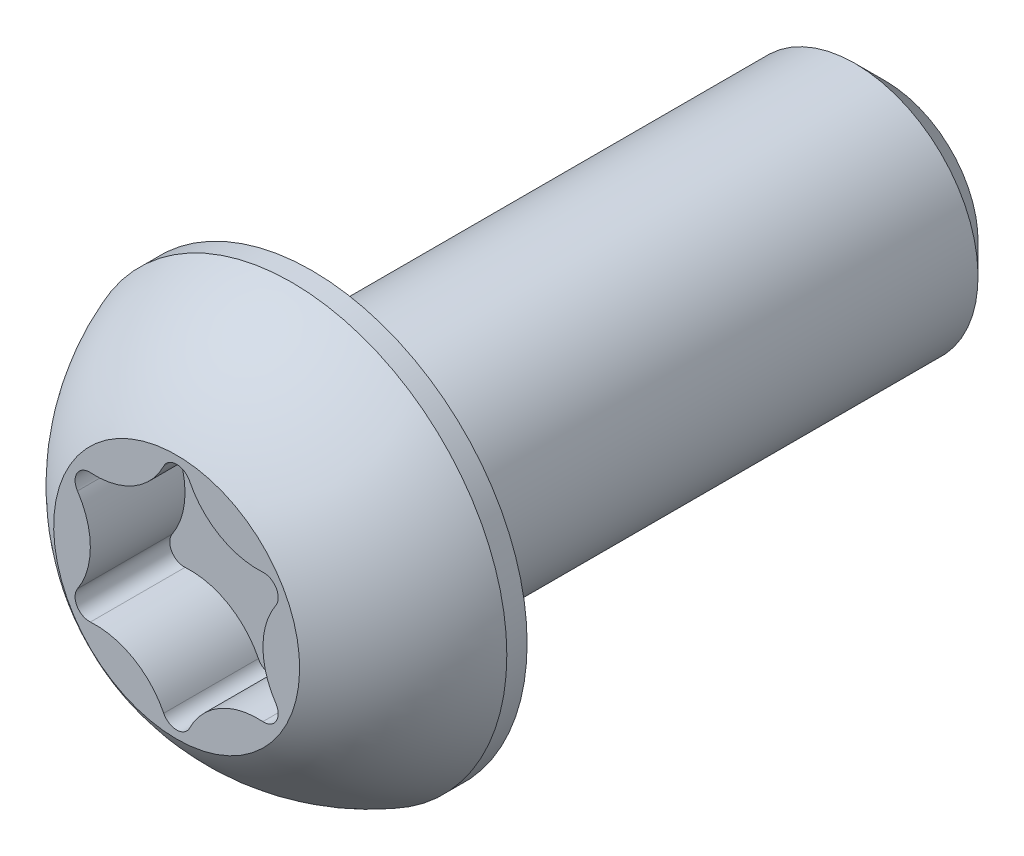
ISO-10303-21;
HEADER;
FILE_DESCRIPTION(('STEP AP214'),'2;1');
FILE_NAME('part.step','',(''),(''),'','','');
FILE_SCHEMA(('AUTOMOTIVE_DESIGN { 1 0 10303 214 1 1 1 1 }'));
ENDSEC;
DATA;
#1=APPLICATION_CONTEXT('core data for automotive mechanical design processes');
#2=APPLICATION_PROTOCOL_DEFINITION('international standard','automotive_design',2000,#1);
#3=PRODUCT_CONTEXT('',#1,'mechanical');
#4=PRODUCT('Part','Part','',(#3));
#5=PRODUCT_RELATED_PRODUCT_CATEGORY('part','',(#4));
#6=PRODUCT_DEFINITION_FORMATION('','',#4);
#7=PRODUCT_DEFINITION_CONTEXT('part definition',#1,'design');
#8=PRODUCT_DEFINITION('design','',#6,#7);
#9=PRODUCT_DEFINITION_SHAPE('','',#8);
#10=(LENGTH_UNIT() NAMED_UNIT(*) SI_UNIT(.MILLI.,.METRE.));
#11=(NAMED_UNIT(*) PLANE_ANGLE_UNIT() SI_UNIT($,.RADIAN.));
#12=(NAMED_UNIT(*) SI_UNIT($,.STERADIAN.) SOLID_ANGLE_UNIT());
#13=UNCERTAINTY_MEASURE_WITH_UNIT(LENGTH_MEASURE(1.E-05),#10,'distance_accuracy_value','');
#14=(GEOMETRIC_REPRESENTATION_CONTEXT(3) GLOBAL_UNCERTAINTY_ASSIGNED_CONTEXT((#13)) GLOBAL_UNIT_ASSIGNED_CONTEXT((#10,
#11,#12)) REPRESENTATION_CONTEXT('',''));
#15=CARTESIAN_POINT('',(0.,0.,0.));
#16=DIRECTION('',(0.,0.,1.));
#17=DIRECTION('',(1.,0.,0.));
#18=AXIS2_PLACEMENT_3D('',#15,#16,#17);
#19=CARTESIAN_POINT('',(0.,0.,-7.));
#20=DIRECTION('',(0.,0.,-1.));
#21=DIRECTION('',(0.,1.,0.));
#22=AXIS2_PLACEMENT_3D('',#19,#20,#21);
#23=CYLINDRICAL_SURFACE('',#22,3.00000000000001);
#24=CARTESIAN_POINT('',(0.,0.,-6.25));
#25=DIRECTION('',(0.,0.,-1.));
#26=DIRECTION('',(0.,1.,0.));
#27=AXIS2_PLACEMENT_3D('',#24,#25,#26);
#28=CIRCLE('',#27,3.00000000000001);
#29=CARTESIAN_POINT('',(0.,3.,-6.25));
#30=VERTEX_POINT('',#29);
#31=EDGE_CURVE('E11',#30,#30,#28,.F.);
#32=ORIENTED_EDGE('',*,*,#31,.T.);
#33=EDGE_LOOP('',(#32));
#34=FACE_BOUND('',#33,.T.);
#35=CARTESIAN_POINT('',(0.,0.,7.));
#36=DIRECTION('',(0.,0.,1.));
#37=DIRECTION('',(0.,-1.,0.));
#38=AXIS2_PLACEMENT_3D('',#35,#36,#37);
#39=CIRCLE('',#38,3.00000000000001);
#40=CARTESIAN_POINT('',(0.,-3.00000000000002,7.));
#41=VERTEX_POINT('',#40);
#42=EDGE_CURVE('E230',#41,#41,#39,.F.);
#43=ORIENTED_EDGE('',*,*,#42,.T.);
#44=EDGE_LOOP('',(#43));
#45=FACE_BOUND('',#44,.T.);
#46=ADVANCED_FACE('F35',(#34,#45),#23,.T.);
#47=CARTESIAN_POINT('',(0.,3.,-7.));
#48=DIRECTION('',(0.,0.,-1.));
#49=DIRECTION('',(0.,1.,0.));
#50=AXIS2_PLACEMENT_3D('',#47,#48,#49);
#51=PLANE('',#50);
#52=CARTESIAN_POINT('',(0.,0.,-7.));
#53=DIRECTION('',(0.,0.,-1.));
#54=DIRECTION('',(0.,1.,0.));
#55=AXIS2_PLACEMENT_3D('',#52,#53,#54);
#56=CIRCLE('',#55,2.25000000000001);
#57=CARTESIAN_POINT('',(0.,2.25000000000001,-7.));
#58=VERTEX_POINT('',#57);
#59=EDGE_CURVE('E44',#58,#58,#56,.T.);
#60=ORIENTED_EDGE('',*,*,#59,.T.);
#61=EDGE_LOOP('',(#60));
#62=FACE_BOUND('',#61,.T.);
#63=ADVANCED_FACE('F235',(#62),#51,.T.);
#64=CARTESIAN_POINT('',(0.,0.,5.58867647058825));
#65=DIRECTION('',(0.,0.,1.));
#66=DIRECTION('',(0.,-1.,0.));
#67=AXIS2_PLACEMENT_3D('',#64,#65,#66);
#68=SPHERICAL_SURFACE('',#67,5.58538892099636);
#69=CARTESIAN_POINT('',(0.,0.,10.3));
#70=DIRECTION('',(0.,0.,1.));
#71=DIRECTION('',(0.,-1.,0.));
#72=AXIS2_PLACEMENT_3D('',#69,#70,#71);
#73=CIRCLE('',#72,2.99999999999999);
#74=CARTESIAN_POINT('',(0.,-3.,10.3));
#75=VERTEX_POINT('',#74);
#76=EDGE_CURVE('E227',#75,#75,#73,.T.);
#77=CARTESIAN_POINT('',(0.,0.,7.495));
#78=DIRECTION('',(0.,0.,1.));
#79=DIRECTION('',(0.,-1.,0.));
#80=AXIS2_PLACEMENT_3D('',#77,#78,#79);
#81=CIRCLE('',#80,5.24999999999998);
#82=CARTESIAN_POINT('',(0.,-5.24999999999999,7.495));
#83=VERTEX_POINT('',#82);
#84=EDGE_CURVE('E220',#83,#83,#81,.T.);
#85=CARTESIAN_POINT('',(0.,-3.,10.3));
#86=CARTESIAN_POINT('',(0.,-3.03216841047471,10.2795163923313));
#87=CARTESIAN_POINT('',(0.,-3.06412696701745,10.258703225294));
#88=CARTESIAN_POINT('',(0.,-3.12761110680184,10.2164267201116));
#89=CARTESIAN_POINT('',(0.,-3.15913669004349,10.1949633819666));
#90=CARTESIAN_POINT('',(0.,-3.22174161778855,10.1513954821982));
#91=CARTESIAN_POINT('',(0.,-3.25282096229196,10.1292909205748));
#92=CARTESIAN_POINT('',(0.,-3.31452038302559,10.0844498636083));
#93=CARTESIAN_POINT('',(0.,-3.34514045925583,10.0617133682651));
#94=CARTESIAN_POINT('',(0.,-3.40590849355866,10.0156179791694));
#95=CARTESIAN_POINT('',(0.,-3.43605645163126,9.9922590854169));
#96=CARTESIAN_POINT('',(0.,-3.49586760131365,9.94492870119812));
#97=CARTESIAN_POINT('',(0.,-3.52553079292344,9.92095721073181));
#98=CARTESIAN_POINT('',(0.,-3.5843599638299,9.87241169039907));
#99=CARTESIAN_POINT('',(0.,-3.61352594312657,9.84783766053263));
#100=CARTESIAN_POINT('',(0.,-3.67134845242052,9.79809737189489));
#101=CARTESIAN_POINT('',(0.,-3.70000498241781,9.77293111312358));
#102=CARTESIAN_POINT('',(0.,-3.75679656980689,9.72201692554921));
#103=CARTESIAN_POINT('',(0.,-3.78493162719868,9.69626899674615));
#104=CARTESIAN_POINT('',(0.,-3.84066846488056,9.64420227205713));
#105=CARTESIAN_POINT('',(0.,-3.86827024517065,9.61788347617118));
#106=CARTESIAN_POINT('',(0.,-3.92292894789283,9.56468605977414));
#107=CARTESIAN_POINT('',(0.,-3.9499858703249,9.53780743926305));
#108=CARTESIAN_POINT('',(0.,-4.00354350517957,9.48350165095855));
#109=CARTESIAN_POINT('',(0.,-4.03004421760217,9.45607448316514));
#110=CARTESIAN_POINT('',(0.,-4.0824783136526,9.40068310778981));
#111=CARTESIAN_POINT('',(0.,-4.10841169728044,9.37271890020789));
#112=CARTESIAN_POINT('',(0.,-4.15970025498779,9.31626517807288));
#113=CARTESIAN_POINT('',(0.,-4.1850554290673,9.28777566351978));
#114=CARTESIAN_POINT('',(0.,-4.23517692952119,9.23028328066041));
#115=CARTESIAN_POINT('',(0.,-4.25994325589556,9.20128041235413));
#116=CARTESIAN_POINT('',(0.,-4.30887666984255,9.14277349059192));
#117=CARTESIAN_POINT('',(0.,-4.33304375741518,9.11326943713599));
#118=CARTESIAN_POINT('',(0.,-4.380768554082,9.05377252395801));
#119=CARTESIAN_POINT('',(0.,-4.4043262631762,9.02377966423597));
#120=CARTESIAN_POINT('',(0.,-4.45082241888371,8.96331772249556));
#121=CARTESIAN_POINT('',(0.,-4.47376086549702,8.9328486404772));
#122=CARTESIAN_POINT('',(0.,-4.51900887206145,8.87144703792041));
#123=CARTESIAN_POINT('',(0.,-4.54131843201258,8.84051451738197));
#124=CARTESIAN_POINT('',(0.,-4.58529930493052,8.77819901600412));
#125=CARTESIAN_POINT('',(0.,-4.60697061789734,8.7468160351647));
#126=CARTESIAN_POINT('',(0.,-4.64966590431094,8.68361278040153));
#127=CARTESIAN_POINT('',(0.,-4.67068987775772,8.65179250647779));
#128=CARTESIAN_POINT('',(0.,-4.71208166419701,8.58772801623582));
#129=CARTESIAN_POINT('',(0.,-4.73244947718952,8.55548379991759));
#130=CARTESIAN_POINT('',(0.,-4.77252039708775,8.49058495344787));
#131=CARTESIAN_POINT('',(0.,-4.79222350399347,8.45793032329637));
#132=CARTESIAN_POINT('',(0.,-4.83095674497553,8.39222434991767));
#133=CARTESIAN_POINT('',(0.,-4.84998687905188,8.35917300669045));
#134=CARTESIAN_POINT('',(0.,-4.88736618998069,8.29268747436186));
#135=CARTESIAN_POINT('',(0.,-4.90571536683315,8.25925328526047));
#136=CARTESIAN_POINT('',(0.,-4.94172506465617,8.19201608902572));
#137=CARTESIAN_POINT('',(0.,-4.95938558562672,8.15821308189235));
#138=CARTESIAN_POINT('',(0.,-4.99401056185102,8.09025243213542));
#139=CARTESIAN_POINT('',(0.,-5.01097501710477,8.05609478951185));
#140=CARTESIAN_POINT('',(0.,-5.04420074452797,7.98743920027233));
#141=CARTESIAN_POINT('',(0.,-5.06046201669743,7.95294125365637));
#142=CARTESIAN_POINT('',(0.,-5.0922745540401,7.88361953010066));
#143=CARTESIAN_POINT('',(0.,-5.10782581921332,7.84879575316091));
#144=CARTESIAN_POINT('',(0.,-5.13821182242716,7.77883698160628));
#145=CARTESIAN_POINT('',(0.,-5.15304656046778,7.7437019869914));
#146=CARTESIAN_POINT('',(0.,-5.18199326796145,7.67313551482884));
#147=CARTESIAN_POINT('',(0.,-5.1961052374145,7.63770403728117));
#148=CARTESIAN_POINT('',(0.,-5.22360055144048,7.5665594900466));
#149=CARTESIAN_POINT('',(0.,-5.2369838960134,7.53084642035971));
#150=CARTESIAN_POINT('',(0.,-5.24999999999999,7.495));
#151=B_SPLINE_CURVE_WITH_KNOTS('',3,(#85,#86,#87,#88,#89,#90,#91,#92,#93,#94,#95,#96,#97,#98,
#99,#100,#101,#102,#103,#104,#105,#106,#107,#108,#109,#110,#111,#112,#113,#114,#115,#116,#117,
#118,#119,#120,#121,#122,#123,#124,#125,#126,#127,#128,#129,#130,#131,#132,#133,#134,#135,#136,
#137,#138,#139,#140,#141,#142,#143,#144,#145,#146,#147,#148,#149,#150),.UNSPECIFIED.,.F.,.F.,(4,
2,2,2,2,2,2,2,2,2,2,2,2,2,2,2,2,2,2,2,2,2,2,2,2,2,2,2,2,2,2,2,4),(0.,0.114407188898184,
0.228814377796368,0.343221566694552,0.457628755592735,0.572035944490919,0.686443133389103,
0.800850322287287,0.915257511185472,1.02966470008366,1.14407188898184,1.25847907788002,
1.37288626677821,1.48729345567639,1.60170064457458,1.71610783347276,1.83051502237094,
1.94492221126913,2.05932940016731,2.1737365890655,2.28814377796368,2.40255096686186,
2.51695815576005,2.63136534465823,2.74577253355641,2.8601797224546,2.97458691135278,
3.08899410025097,3.20340128914915,3.31780847804733,3.43221566694552,3.5466228558437,
3.66103004474189),.UNSPECIFIED.);
#152=EDGE_CURVE('BSEAM250',#75,#83,#151,.T.);
#153=ORIENTED_EDGE('',*,*,#76,.F.);
#154=ORIENTED_EDGE('',*,*,#84,.T.);
#155=ORIENTED_EDGE('',*,*,#152,.T.);
#156=ORIENTED_EDGE('',*,*,#152,.F.);
#157=EDGE_LOOP('',(#153,#155,#154,#156));
#158=FACE_BOUND('',#157,.T.);
#159=ADVANCED_FACE('F250',(#158),#68,.T.);
#160=CARTESIAN_POINT('',(0.,-3.,10.3));
#161=DIRECTION('',(0.,0.,-1.));
#162=DIRECTION('',(0.,1.,0.));
#163=AXIS2_PLACEMENT_3D('',#160,#161,#162);
#164=PLANE('',#163);
#165=CARTESIAN_POINT('',(-1.98180092589016,-3.43257989412881,10.3));
#166=DIRECTION('',(0.,0.,-1.));
#167=DIRECTION('',(0.499999999999998,0.86602540378444,0.));
#168=AXIS2_PLACEMENT_3D('',#165,#166,#167);
#169=CIRCLE('',#168,1.85857685178033);
#170=CARTESIAN_POINT('',(-2.10380836603343,-1.57801199337042,10.3));
#171=VERTEX_POINT('',#170);
#172=CARTESIAN_POINT('',(-0.314694290718586,-2.61095748636439,10.3));
#173=VERTEX_POINT('',#172);
#174=EDGE_CURVE('E68',#171,#173,#169,.T.);
#175=ORIENTED_EDGE('',*,*,#174,.F.);
#176=CARTESIAN_POINT('',(-2.12683931320156,-1.22793125,10.3));
#177=DIRECTION('',(0.,0.,1.));
#178=DIRECTION('',(1.,0.,0.));
#179=AXIS2_PLACEMENT_3D('',#176,#177,#178);
#180=CIRCLE('',#179,0.3508375);
#181=CARTESIAN_POINT('',(-2.41850265675202,-1.03294549299397,10.3));
#182=VERTEX_POINT('',#181);
#183=EDGE_CURVE('E211',#182,#171,#180,.T.);
#184=ORIENTED_EDGE('',*,*,#183,.F.);
#185=CARTESIAN_POINT('',(-3.96360185178033,0.,10.3));
#186=DIRECTION('',(0.,0.,-1.));
#187=DIRECTION('',(1.,0.,0.));
#188=AXIS2_PLACEMENT_3D('',#185,#186,#187);
#189=CIRCLE('',#188,1.85857685178033);
#190=CARTESIAN_POINT('',(-2.41850265675202,1.03294549299397,10.3));
#191=VERTEX_POINT('',#190);
#192=EDGE_CURVE('E216',#191,#182,#189,.T.);
#193=ORIENTED_EDGE('',*,*,#192,.F.);
#194=CARTESIAN_POINT('',(-2.12683931320156,1.22793125,10.3));
#195=DIRECTION('',(0.,0.,1.));
#196=DIRECTION('',(1.,0.,0.));
#197=AXIS2_PLACEMENT_3D('',#194,#195,#196);
#198=CIRCLE('',#197,0.3508375);
#199=CARTESIAN_POINT('',(-2.10380836603345,1.5780119933704,10.3));
#200=VERTEX_POINT('',#199);
#201=EDGE_CURVE('E207',#200,#191,#198,.T.);
#202=ORIENTED_EDGE('',*,*,#201,.F.);
#203=CARTESIAN_POINT('',(-1.9818009258902,3.43257989412879,10.3));
#204=DIRECTION('',(0.,0.,-1.));
#205=DIRECTION('',(0.50000000000001,-0.866025403784433,0.));
#206=AXIS2_PLACEMENT_3D('',#203,#204,#205);
#207=CIRCLE('',#206,1.85857685178033);
#208=CARTESIAN_POINT('',(-0.314694290718619,2.61095748636439,10.3));
#209=VERTEX_POINT('',#208);
#210=EDGE_CURVE('E155',#209,#200,#207,.T.);
#211=ORIENTED_EDGE('',*,*,#210,.F.);
#212=CARTESIAN_POINT('',(0.,2.4558625,10.3));
#213=DIRECTION('',(0.,0.,1.));
#214=DIRECTION('',(-0.499999999999992,-0.866025403784443,0.));
#215=AXIS2_PLACEMENT_3D('',#212,#213,#214);
#216=CIRCLE('',#215,0.3508375);
#217=CARTESIAN_POINT('',(0.314694290718568,2.6109574863644,10.3));
#218=VERTEX_POINT('',#217);
#219=EDGE_CURVE('E154',#218,#209,#216,.T.);
#220=ORIENTED_EDGE('',*,*,#219,.F.);
#221=CARTESIAN_POINT('',(1.98180092589014,3.43257989412883,10.3));
#222=DIRECTION('',(0.,0.,-1.));
#223=DIRECTION('',(-0.499999999999992,-0.866025403784443,0.));
#224=AXIS2_PLACEMENT_3D('',#221,#222,#223);
#225=CIRCLE('',#224,1.85857685178033);
#226=CARTESIAN_POINT('',(2.10380836603342,1.57801199337044,10.3));
#227=VERTEX_POINT('',#226);
#228=EDGE_CURVE('E163',#227,#218,#225,.T.);
#229=ORIENTED_EDGE('',*,*,#228,.F.);
#230=CARTESIAN_POINT('',(2.12683931320156,1.22793125,10.3));
#231=DIRECTION('',(0.,0.,1.));
#232=DIRECTION('',(-1.,0.,0.));
#233=AXIS2_PLACEMENT_3D('',#230,#231,#232);
#234=CIRCLE('',#233,0.3508375);
#235=CARTESIAN_POINT('',(2.41850265675202,1.03294549299397,10.3));
#236=VERTEX_POINT('',#235);
#237=EDGE_CURVE('E180',#236,#227,#234,.T.);
#238=ORIENTED_EDGE('',*,*,#237,.F.);
#239=CARTESIAN_POINT('',(3.96360185178033,0.,10.3));
#240=DIRECTION('',(0.,0.,-1.));
#241=DIRECTION('',(-1.,0.,0.));
#242=AXIS2_PLACEMENT_3D('',#239,#240,#241);
#243=CIRCLE('',#242,1.85857685178033);
#244=CARTESIAN_POINT('',(2.41850265675202,-1.03294549299397,10.3));
#245=VERTEX_POINT('',#244);
#246=EDGE_CURVE('E175',#245,#236,#243,.T.);
#247=ORIENTED_EDGE('',*,*,#246,.F.);
#248=CARTESIAN_POINT('',(2.12683931320157,-1.22793124999999,10.3));
#249=DIRECTION('',(0.,0.,1.));
#250=DIRECTION('',(-0.500000000000004,0.866025403784436,0.));
#251=AXIS2_PLACEMENT_3D('',#248,#249,#250);
#252=CIRCLE('',#251,0.3508375);
#253=CARTESIAN_POINT('',(2.10380836603344,-1.57801199337041,10.3));
#254=VERTEX_POINT('',#253);
#255=EDGE_CURVE('E194',#254,#245,#252,.T.);
#256=ORIENTED_EDGE('',*,*,#255,.F.);
#257=CARTESIAN_POINT('',(1.98180092589018,-3.43257989412881,10.3));
#258=DIRECTION('',(0.,0.,-1.));
#259=DIRECTION('',(-0.500000000000004,0.866025403784436,0.));
#260=AXIS2_PLACEMENT_3D('',#257,#258,#259);
#261=CIRCLE('',#260,1.85857685178033);
#262=CARTESIAN_POINT('',(0.314694290718601,-2.61095748636439,10.3));
#263=VERTEX_POINT('',#262);
#264=EDGE_CURVE('E189',#263,#254,#261,.T.);
#265=ORIENTED_EDGE('',*,*,#264,.F.);
#266=CARTESIAN_POINT('',(0.,-2.4558625,10.3));
#267=DIRECTION('',(0.,0.,1.));
#268=DIRECTION('',(0.499999999999998,0.86602540378444,0.));
#269=AXIS2_PLACEMENT_3D('',#266,#267,#268);
#270=CIRCLE('',#269,0.3508375);
#271=EDGE_CURVE('E205',#173,#263,#270,.T.);
#272=ORIENTED_EDGE('',*,*,#271,.F.);
#273=EDGE_LOOP('',(#175,#184,#193,#202,#211,#220,#229,#238,#247,#256,#265,#272));
#274=FACE_BOUND('',#273,.T.);
#275=ORIENTED_EDGE('',*,*,#76,.T.);
#276=EDGE_LOOP('',(#275));
#277=FACE_BOUND('',#276,.T.);
#278=ADVANCED_FACE('F256',(#274,#277),#164,.F.);
#279=CARTESIAN_POINT('',(0.,-5.24999999999999,7.));
#280=DIRECTION('',(0.,0.,1.));
#281=DIRECTION('',(0.,-1.,0.));
#282=AXIS2_PLACEMENT_3D('',#279,#280,#281);
#283=PLANE('',#282);
#284=ORIENTED_EDGE('',*,*,#42,.F.);
#285=EDGE_LOOP('',(#284));
#286=FACE_BOUND('',#285,.T.);
#287=CARTESIAN_POINT('',(0.,0.,7.));
#288=DIRECTION('',(0.,0.,1.));
#289=DIRECTION('',(0.,-1.,0.));
#290=AXIS2_PLACEMENT_3D('',#287,#288,#289);
#291=CIRCLE('',#290,5.24999999999998);
#292=CARTESIAN_POINT('',(0.,-5.24999999999999,7.));
#293=VERTEX_POINT('',#292);
#294=EDGE_CURVE('E224',#293,#293,#291,.T.);
#295=ORIENTED_EDGE('',*,*,#294,.F.);
#296=EDGE_LOOP('',(#295));
#297=FACE_BOUND('',#296,.T.);
#298=ADVANCED_FACE('F260',(#286,#297),#283,.F.);
#299=CARTESIAN_POINT('',(0.,0.,10.3));
#300=DIRECTION('',(0.,0.,1.));
#301=DIRECTION('',(0.,-1.,0.));
#302=AXIS2_PLACEMENT_3D('',#299,#300,#301);
#303=CYLINDRICAL_SURFACE('',#302,5.24999999999998);
#304=ORIENTED_EDGE('',*,*,#84,.F.);
#305=EDGE_LOOP('',(#304));
#306=FACE_BOUND('',#305,.T.);
#307=ORIENTED_EDGE('',*,*,#294,.T.);
#308=EDGE_LOOP('',(#307));
#309=FACE_BOUND('',#308,.T.);
#310=ADVANCED_FACE('F264',(#306,#309),#303,.T.);
#311=CARTESIAN_POINT('',(-2.12683931320156,-1.22793125,7.99));
#312=DIRECTION('',(0.,0.,1.));
#313=DIRECTION('',(1.,0.,0.));
#314=AXIS2_PLACEMENT_3D('',#311,#312,#313);
#315=CYLINDRICAL_SURFACE('',#314,0.3508375);
#316=ORIENTED_EDGE('',*,*,#183,.T.);
#317=DIRECTION('',(0.,0.,1.));
#318=VECTOR('',#317,1.);
#319=CARTESIAN_POINT('',(-2.10380836603343,-1.57801199337042,7.99));
#320=LINE('',#319,#318);
#321=CARTESIAN_POINT('',(-2.10380836603343,-1.57801199337042,7.99));
#322=VERTEX_POINT('',#321);
#323=EDGE_CURVE('E200',#322,#171,#320,.T.);
#324=ORIENTED_EDGE('',*,*,#323,.F.);
#325=CARTESIAN_POINT('',(-2.12683931320156,-1.22793125,7.99));
#326=DIRECTION('',(0.,0.,1.));
#327=DIRECTION('',(1.,0.,0.));
#328=AXIS2_PLACEMENT_3D('',#325,#326,#327);
#329=CIRCLE('',#328,0.3508375);
#330=CARTESIAN_POINT('',(-2.41850265675202,-1.03294549299397,7.99));
#331=VERTEX_POINT('',#330);
#332=EDGE_CURVE('E213',#331,#322,#329,.T.);
#333=ORIENTED_EDGE('',*,*,#332,.F.);
#334=DIRECTION('',(0.,0.,1.));
#335=VECTOR('',#334,1.);
#336=CARTESIAN_POINT('',(-2.41850265675202,-1.03294549299397,7.99));
#337=LINE('',#336,#335);
#338=EDGE_CURVE('E52',#331,#182,#337,.T.);
#339=ORIENTED_EDGE('',*,*,#338,.T.);
#340=EDGE_LOOP('',(#316,#324,#333,#339));
#341=FACE_BOUND('',#340,.T.);
#342=ADVANCED_FACE('F268',(#341),#315,.F.);
#343=CARTESIAN_POINT('',(-3.96360185178033,0.,7.99));
#344=DIRECTION('',(0.,0.,1.));
#345=DIRECTION('',(1.,0.,0.));
#346=AXIS2_PLACEMENT_3D('',#343,#344,#345);
#347=CYLINDRICAL_SURFACE('',#346,1.85857685178033);
#348=ORIENTED_EDGE('',*,*,#192,.T.);
#349=ORIENTED_EDGE('',*,*,#338,.F.);
#350=CARTESIAN_POINT('',(-3.96360185178033,0.,7.99));
#351=DIRECTION('',(0.,0.,-1.));
#352=DIRECTION('',(1.,0.,0.));
#353=AXIS2_PLACEMENT_3D('',#350,#351,#352);
#354=CIRCLE('',#353,1.85857685178033);
#355=CARTESIAN_POINT('',(-2.41850265675202,1.03294549299397,7.99));
#356=VERTEX_POINT('',#355);
#357=EDGE_CURVE('E210',#356,#331,#354,.T.);
#358=ORIENTED_EDGE('',*,*,#357,.F.);
#359=DIRECTION('',(0.,0.,1.));
#360=VECTOR('',#359,1.);
#361=CARTESIAN_POINT('',(-2.41850265675202,1.03294549299397,7.99));
#362=LINE('',#361,#360);
#363=EDGE_CURVE('E60',#356,#191,#362,.T.);
#364=ORIENTED_EDGE('',*,*,#363,.T.);
#365=EDGE_LOOP('',(#348,#349,#358,#364));
#366=FACE_BOUND('',#365,.T.);
#367=ADVANCED_FACE('F273',(#366),#347,.T.);
#368=CARTESIAN_POINT('',(-2.12683931320156,1.22793125,7.99));
#369=DIRECTION('',(0.,0.,1.));
#370=DIRECTION('',(1.,0.,0.));
#371=AXIS2_PLACEMENT_3D('',#368,#369,#370);
#372=CYLINDRICAL_SURFACE('',#371,0.3508375);
#373=ORIENTED_EDGE('',*,*,#201,.T.);
#374=ORIENTED_EDGE('',*,*,#363,.F.);
#375=CARTESIAN_POINT('',(-2.12683931320156,1.22793125,7.99));
#376=DIRECTION('',(0.,0.,1.));
#377=DIRECTION('',(1.,0.,0.));
#378=AXIS2_PLACEMENT_3D('',#375,#376,#377);
#379=CIRCLE('',#378,0.3508375);
#380=CARTESIAN_POINT('',(-2.10380836603345,1.5780119933704,7.99));
#381=VERTEX_POINT('',#380);
#382=EDGE_CURVE('E208',#381,#356,#379,.T.);
#383=ORIENTED_EDGE('',*,*,#382,.F.);
#384=DIRECTION('',(0.,0.,1.));
#385=VECTOR('',#384,1.);
#386=CARTESIAN_POINT('',(-2.10380836603345,1.5780119933704,7.99));
#387=LINE('',#386,#385);
#388=EDGE_CURVE('E150',#381,#200,#387,.T.);
#389=ORIENTED_EDGE('',*,*,#388,.T.);
#390=EDGE_LOOP('',(#373,#374,#383,#389));
#391=FACE_BOUND('',#390,.T.);
#392=ADVANCED_FACE('F270',(#391),#372,.F.);
#393=CARTESIAN_POINT('',(-2.12683931320156,-1.22793125,7.99));
#394=DIRECTION('',(0.,0.,1.));
#395=DIRECTION('',(1.,0.,0.));
#396=AXIS2_PLACEMENT_3D('',#393,#394,#395);
#397=PLANE('',#396);
#398=ORIENTED_EDGE('',*,*,#332,.T.);
#399=CARTESIAN_POINT('',(-1.98180092589016,-3.43257989412881,7.99));
#400=DIRECTION('',(0.,0.,-1.));
#401=DIRECTION('',(0.499999999999998,0.86602540378444,0.));
#402=AXIS2_PLACEMENT_3D('',#399,#400,#401);
#403=CIRCLE('',#402,1.85857685178033);
#404=CARTESIAN_POINT('',(-0.314694290718586,-2.61095748636439,7.99));
#405=VERTEX_POINT('',#404);
#406=EDGE_CURVE('E196',#322,#405,#403,.T.);
#407=ORIENTED_EDGE('',*,*,#406,.T.);
#408=CARTESIAN_POINT('',(0.,-2.4558625,7.99));
#409=DIRECTION('',(0.,0.,1.));
#410=DIRECTION('',(0.499999999999998,0.86602540378444,0.));
#411=AXIS2_PLACEMENT_3D('',#408,#409,#410);
#412=CIRCLE('',#411,0.3508375);
#413=CARTESIAN_POINT('',(0.314694290718601,-2.61095748636439,7.99));
#414=VERTEX_POINT('',#413);
#415=EDGE_CURVE('E198',#405,#414,#412,.T.);
#416=ORIENTED_EDGE('',*,*,#415,.T.);
#417=CARTESIAN_POINT('',(1.98180092589018,-3.43257989412881,7.99));
#418=DIRECTION('',(0.,0.,-1.));
#419=DIRECTION('',(-0.500000000000004,0.866025403784436,0.));
#420=AXIS2_PLACEMENT_3D('',#417,#418,#419);
#421=CIRCLE('',#420,1.85857685178033);
#422=CARTESIAN_POINT('',(2.10380836603344,-1.57801199337041,7.99));
#423=VERTEX_POINT('',#422);
#424=EDGE_CURVE('E182',#414,#423,#421,.T.);
#425=ORIENTED_EDGE('',*,*,#424,.T.);
#426=CARTESIAN_POINT('',(2.12683931320157,-1.22793124999999,7.99));
#427=DIRECTION('',(0.,0.,1.));
#428=DIRECTION('',(-0.500000000000004,0.866025403784436,0.));
#429=AXIS2_PLACEMENT_3D('',#426,#427,#428);
#430=CIRCLE('',#429,0.3508375);
#431=CARTESIAN_POINT('',(2.41850265675202,-1.03294549299397,7.99));
#432=VERTEX_POINT('',#431);
#433=EDGE_CURVE('E184',#423,#432,#430,.T.);
#434=ORIENTED_EDGE('',*,*,#433,.T.);
#435=CARTESIAN_POINT('',(3.96360185178033,0.,7.99));
#436=DIRECTION('',(0.,0.,-1.));
#437=DIRECTION('',(-1.,0.,0.));
#438=AXIS2_PLACEMENT_3D('',#435,#436,#437);
#439=CIRCLE('',#438,1.85857685178033);
#440=CARTESIAN_POINT('',(2.41850265675202,1.03294549299397,7.99));
#441=VERTEX_POINT('',#440);
#442=EDGE_CURVE('E168',#432,#441,#439,.T.);
#443=ORIENTED_EDGE('',*,*,#442,.T.);
#444=CARTESIAN_POINT('',(2.12683931320156,1.22793125,7.99));
#445=DIRECTION('',(0.,0.,1.));
#446=DIRECTION('',(-1.,0.,0.));
#447=AXIS2_PLACEMENT_3D('',#444,#445,#446);
#448=CIRCLE('',#447,0.3508375);
#449=CARTESIAN_POINT('',(2.10380836603342,1.57801199337044,7.99));
#450=VERTEX_POINT('',#449);
#451=EDGE_CURVE('E170',#441,#450,#448,.T.);
#452=ORIENTED_EDGE('',*,*,#451,.T.);
#453=CARTESIAN_POINT('',(1.98180092589014,3.43257989412883,7.99));
#454=DIRECTION('',(0.,0.,-1.));
#455=DIRECTION('',(-0.499999999999992,-0.866025403784443,0.));
#456=AXIS2_PLACEMENT_3D('',#453,#454,#455);
#457=CIRCLE('',#456,1.85857685178033);
#458=CARTESIAN_POINT('',(0.314694290718568,2.6109574863644,7.99));
#459=VERTEX_POINT('',#458);
#460=EDGE_CURVE('E136',#450,#459,#457,.T.);
#461=ORIENTED_EDGE('',*,*,#460,.T.);
#462=CARTESIAN_POINT('',(0.,2.4558625,7.99));
#463=DIRECTION('',(0.,0.,1.));
#464=DIRECTION('',(-0.499999999999992,-0.866025403784443,0.));
#465=AXIS2_PLACEMENT_3D('',#462,#463,#464);
#466=CIRCLE('',#465,0.3508375);
#467=CARTESIAN_POINT('',(-0.314694290718619,2.61095748636439,7.99));
#468=VERTEX_POINT('',#467);
#469=EDGE_CURVE('E129',#459,#468,#466,.T.);
#470=ORIENTED_EDGE('',*,*,#469,.T.);
#471=CARTESIAN_POINT('',(-1.9818009258902,3.43257989412879,7.99));
#472=DIRECTION('',(0.,0.,-1.));
#473=DIRECTION('',(0.50000000000001,-0.866025403784433,0.));
#474=AXIS2_PLACEMENT_3D('',#471,#472,#473);
#475=CIRCLE('',#474,1.85857685178033);
#476=EDGE_CURVE('E133',#468,#381,#475,.T.);
#477=ORIENTED_EDGE('',*,*,#476,.T.);
#478=ORIENTED_EDGE('',*,*,#382,.T.);
#479=ORIENTED_EDGE('',*,*,#357,.T.);
#480=EDGE_LOOP('',(#398,#407,#416,#425,#434,#443,#452,#461,#470,#477,#478,#479));
#481=FACE_BOUND('',#480,.T.);
#482=ADVANCED_FACE('F131',(#481),#397,.T.);
#483=CARTESIAN_POINT('',(0.,-2.4558625,7.99));
#484=DIRECTION('',(0.,0.,1.));
#485=DIRECTION('',(0.499999999999998,0.86602540378444,0.));
#486=AXIS2_PLACEMENT_3D('',#483,#484,#485);
#487=CYLINDRICAL_SURFACE('',#486,0.3508375);
#488=ORIENTED_EDGE('',*,*,#271,.T.);
#489=DIRECTION('',(0.,0.,1.));
#490=VECTOR('',#489,1.);
#491=CARTESIAN_POINT('',(0.314694290718601,-2.61095748636439,7.99));
#492=LINE('',#491,#490);
#493=EDGE_CURVE('E186',#414,#263,#492,.T.);
#494=ORIENTED_EDGE('',*,*,#493,.F.);
#495=ORIENTED_EDGE('',*,*,#415,.F.);
#496=DIRECTION('',(0.,0.,1.));
#497=VECTOR('',#496,1.);
#498=CARTESIAN_POINT('',(-0.314694290718586,-2.61095748636439,7.99));
#499=LINE('',#498,#497);
#500=EDGE_CURVE('E203',#405,#173,#499,.T.);
#501=ORIENTED_EDGE('',*,*,#500,.T.);
#502=EDGE_LOOP('',(#488,#494,#495,#501));
#503=FACE_BOUND('',#502,.T.);
#504=ADVANCED_FACE('F282',(#503),#487,.F.);
#505=CARTESIAN_POINT('',(-1.98180092589016,-3.43257989412881,7.99));
#506=DIRECTION('',(0.,0.,1.));
#507=DIRECTION('',(0.499999999999998,0.86602540378444,0.));
#508=AXIS2_PLACEMENT_3D('',#505,#506,#507);
#509=CYLINDRICAL_SURFACE('',#508,1.85857685178033);
#510=ORIENTED_EDGE('',*,*,#174,.T.);
#511=ORIENTED_EDGE('',*,*,#500,.F.);
#512=ORIENTED_EDGE('',*,*,#406,.F.);
#513=ORIENTED_EDGE('',*,*,#323,.T.);
#514=EDGE_LOOP('',(#510,#511,#512,#513));
#515=FACE_BOUND('',#514,.T.);
#516=ADVANCED_FACE('F285',(#515),#509,.T.);
#517=CARTESIAN_POINT('',(2.12683931320157,-1.22793124999999,7.99));
#518=DIRECTION('',(0.,0.,1.));
#519=DIRECTION('',(-0.500000000000004,0.866025403784436,0.));
#520=AXIS2_PLACEMENT_3D('',#517,#518,#519);
#521=CYLINDRICAL_SURFACE('',#520,0.3508375);
#522=ORIENTED_EDGE('',*,*,#255,.T.);
#523=DIRECTION('',(0.,0.,1.));
#524=VECTOR('',#523,1.);
#525=CARTESIAN_POINT('',(2.41850265675202,-1.03294549299397,7.99));
#526=LINE('',#525,#524);
#527=EDGE_CURVE('E172',#432,#245,#526,.T.);
#528=ORIENTED_EDGE('',*,*,#527,.F.);
#529=ORIENTED_EDGE('',*,*,#433,.F.);
#530=DIRECTION('',(0.,0.,1.));
#531=VECTOR('',#530,1.);
#532=CARTESIAN_POINT('',(2.10380836603344,-1.57801199337041,7.99));
#533=LINE('',#532,#531);
#534=EDGE_CURVE('E191',#423,#254,#533,.T.);
#535=ORIENTED_EDGE('',*,*,#534,.T.);
#536=EDGE_LOOP('',(#522,#528,#529,#535));
#537=FACE_BOUND('',#536,.T.);
#538=ADVANCED_FACE('F289',(#537),#521,.F.);
#539=CARTESIAN_POINT('',(1.98180092589018,-3.43257989412881,7.99));
#540=DIRECTION('',(0.,0.,1.));
#541=DIRECTION('',(-0.500000000000004,0.866025403784436,0.));
#542=AXIS2_PLACEMENT_3D('',#539,#540,#541);
#543=CYLINDRICAL_SURFACE('',#542,1.85857685178033);
#544=ORIENTED_EDGE('',*,*,#264,.T.);
#545=ORIENTED_EDGE('',*,*,#534,.F.);
#546=ORIENTED_EDGE('',*,*,#424,.F.);
#547=ORIENTED_EDGE('',*,*,#493,.T.);
#548=EDGE_LOOP('',(#544,#545,#546,#547));
#549=FACE_BOUND('',#548,.T.);
#550=ADVANCED_FACE('F292',(#549),#543,.T.);
#551=CARTESIAN_POINT('',(2.12683931320156,1.22793125,7.99));
#552=DIRECTION('',(0.,0.,1.));
#553=DIRECTION('',(-1.,0.,0.));
#554=AXIS2_PLACEMENT_3D('',#551,#552,#553);
#555=CYLINDRICAL_SURFACE('',#554,0.3508375);
#556=ORIENTED_EDGE('',*,*,#237,.T.);
#557=DIRECTION('',(0.,0.,1.));
#558=VECTOR('',#557,1.);
#559=CARTESIAN_POINT('',(2.10380836603342,1.57801199337044,7.99));
#560=LINE('',#559,#558);
#561=EDGE_CURVE('E141',#450,#227,#560,.T.);
#562=ORIENTED_EDGE('',*,*,#561,.F.);
#563=ORIENTED_EDGE('',*,*,#451,.F.);
#564=DIRECTION('',(0.,0.,1.));
#565=VECTOR('',#564,1.);
#566=CARTESIAN_POINT('',(2.41850265675202,1.03294549299397,7.99));
#567=LINE('',#566,#565);
#568=EDGE_CURVE('E177',#441,#236,#567,.T.);
#569=ORIENTED_EDGE('',*,*,#568,.T.);
#570=EDGE_LOOP('',(#556,#562,#563,#569));
#571=FACE_BOUND('',#570,.T.);
#572=ADVANCED_FACE('F296',(#571),#555,.F.);
#573=CARTESIAN_POINT('',(3.96360185178033,0.,7.99));
#574=DIRECTION('',(0.,0.,1.));
#575=DIRECTION('',(-1.,0.,0.));
#576=AXIS2_PLACEMENT_3D('',#573,#574,#575);
#577=CYLINDRICAL_SURFACE('',#576,1.85857685178033);
#578=ORIENTED_EDGE('',*,*,#246,.T.);
#579=ORIENTED_EDGE('',*,*,#568,.F.);
#580=ORIENTED_EDGE('',*,*,#442,.F.);
#581=ORIENTED_EDGE('',*,*,#527,.T.);
#582=EDGE_LOOP('',(#578,#579,#580,#581));
#583=FACE_BOUND('',#582,.T.);
#584=ADVANCED_FACE('F300',(#583),#577,.T.);
#585=CARTESIAN_POINT('',(0.,2.4558625,7.99));
#586=DIRECTION('',(0.,0.,1.));
#587=DIRECTION('',(-0.499999999999992,-0.866025403784443,0.));
#588=AXIS2_PLACEMENT_3D('',#585,#586,#587);
#589=CYLINDRICAL_SURFACE('',#588,0.3508375);
#590=ORIENTED_EDGE('',*,*,#219,.T.);
#591=DIRECTION('',(0.,0.,1.));
#592=VECTOR('',#591,1.);
#593=CARTESIAN_POINT('',(-0.314694290718619,2.61095748636439,7.99));
#594=LINE('',#593,#592);
#595=EDGE_CURVE('E147',#468,#209,#594,.T.);
#596=ORIENTED_EDGE('',*,*,#595,.F.);
#597=ORIENTED_EDGE('',*,*,#469,.F.);
#598=DIRECTION('',(0.,0.,1.));
#599=VECTOR('',#598,1.);
#600=CARTESIAN_POINT('',(0.314694290718568,2.6109574863644,7.99));
#601=LINE('',#600,#599);
#602=EDGE_CURVE('E165',#459,#218,#601,.T.);
#603=ORIENTED_EDGE('',*,*,#602,.T.);
#604=EDGE_LOOP('',(#590,#596,#597,#603));
#605=FACE_BOUND('',#604,.T.);
#606=ADVANCED_FACE('F152',(#605),#589,.F.);
#607=CARTESIAN_POINT('',(1.98180092589014,3.43257989412883,7.99));
#608=DIRECTION('',(0.,0.,1.));
#609=DIRECTION('',(-0.499999999999992,-0.866025403784443,0.));
#610=AXIS2_PLACEMENT_3D('',#607,#608,#609);
#611=CYLINDRICAL_SURFACE('',#610,1.85857685178033);
#612=ORIENTED_EDGE('',*,*,#228,.T.);
#613=ORIENTED_EDGE('',*,*,#602,.F.);
#614=ORIENTED_EDGE('',*,*,#460,.F.);
#615=ORIENTED_EDGE('',*,*,#561,.T.);
#616=EDGE_LOOP('',(#612,#613,#614,#615));
#617=FACE_BOUND('',#616,.T.);
#618=ADVANCED_FACE('F242',(#617),#611,.T.);
#619=CARTESIAN_POINT('',(-1.9818009258902,3.43257989412879,7.99));
#620=DIRECTION('',(0.,0.,1.));
#621=DIRECTION('',(0.50000000000001,-0.866025403784433,0.));
#622=AXIS2_PLACEMENT_3D('',#619,#620,#621);
#623=CYLINDRICAL_SURFACE('',#622,1.85857685178033);
#624=ORIENTED_EDGE('',*,*,#210,.T.);
#625=ORIENTED_EDGE('',*,*,#388,.F.);
#626=ORIENTED_EDGE('',*,*,#476,.F.);
#627=ORIENTED_EDGE('',*,*,#595,.T.);
#628=EDGE_LOOP('',(#624,#625,#626,#627));
#629=FACE_BOUND('',#628,.T.);
#630=ADVANCED_FACE('F146',(#629),#623,.T.);
#631=CARTESIAN_POINT('',(0.,0.,-7.));
#632=DIRECTION('',(0.,0.,1.));
#633=DIRECTION('',(0.,-1.,0.));
#634=AXIS2_PLACEMENT_3D('',#631,#632,#633);
#635=CONICAL_SURFACE('',#634,2.25000000000001,0.785398163397446);
#636=ORIENTED_EDGE('',*,*,#31,.F.);
#637=EDGE_LOOP('',(#636));
#638=FACE_BOUND('',#637,.T.);
#639=ORIENTED_EDGE('',*,*,#59,.F.);
#640=EDGE_LOOP('',(#639));
#641=FACE_BOUND('',#640,.T.);
#642=ADVANCED_FACE('F37',(#638,#641),#635,.T.);
#643=CLOSED_SHELL('',(#46,#63,#159,#278,#298,#310,#342,#367,#392,#482,#504,#516,#538,#550,#572,
#584,#606,#618,#630,#642));
#644=MANIFOLD_SOLID_BREP('B2',#643);
#645=ADVANCED_BREP_SHAPE_REPRESENTATION('',(#18,#644),#14);
#646=SHAPE_DEFINITION_REPRESENTATION(#9,#645);
ENDSEC;
END-ISO-10303-21;
